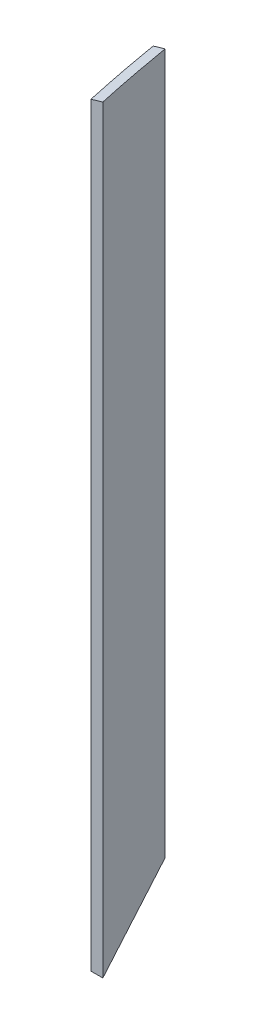
ISO-10303-21;
HEADER;
FILE_DESCRIPTION(('STEP AP214'),'2;1');
FILE_NAME('part.step','',(''),(''),'','','');
FILE_SCHEMA(('AUTOMOTIVE_DESIGN { 1 0 10303 214 1 1 1 1 }'));
ENDSEC;
DATA;
#1=APPLICATION_CONTEXT('core data for automotive mechanical design processes');
#2=APPLICATION_PROTOCOL_DEFINITION('international standard','automotive_design',2000,#1);
#3=PRODUCT_CONTEXT('',#1,'mechanical');
#4=PRODUCT('Part','Part','',(#3));
#5=PRODUCT_RELATED_PRODUCT_CATEGORY('part','',(#4));
#6=PRODUCT_DEFINITION_FORMATION('','',#4);
#7=PRODUCT_DEFINITION_CONTEXT('part definition',#1,'design');
#8=PRODUCT_DEFINITION('design','',#6,#7);
#9=PRODUCT_DEFINITION_SHAPE('','',#8);
#10=(LENGTH_UNIT() NAMED_UNIT(*) SI_UNIT(.MILLI.,.METRE.));
#11=(NAMED_UNIT(*) PLANE_ANGLE_UNIT() SI_UNIT($,.RADIAN.));
#12=(NAMED_UNIT(*) SI_UNIT($,.STERADIAN.) SOLID_ANGLE_UNIT());
#13=UNCERTAINTY_MEASURE_WITH_UNIT(LENGTH_MEASURE(1.E-05),#10,'distance_accuracy_value','');
#14=(GEOMETRIC_REPRESENTATION_CONTEXT(3) GLOBAL_UNCERTAINTY_ASSIGNED_CONTEXT((#13)) GLOBAL_UNIT_ASSIGNED_CONTEXT((#10,
#11,#12)) REPRESENTATION_CONTEXT('',''));
#15=CARTESIAN_POINT('',(0.,0.,0.));
#16=DIRECTION('',(0.,0.,1.));
#17=DIRECTION('',(1.,0.,0.));
#18=AXIS2_PLACEMENT_3D('',#15,#16,#17);
#19=CARTESIAN_POINT('',(114.914214415963,110.654023481096,18.6636491961611));
#20=CARTESIAN_POINT('',(114.611184070619,110.653984163291,18.6634138121703));
#21=CARTESIAN_POINT('',(114.006281502718,110.649256729008,18.6581194765323));
#22=CARTESIAN_POINT('',(113.093367138106,110.6278778152,18.6353544123418));
#23=CARTESIAN_POINT('',(112.194084289625,110.592697363985,18.598310150078));
#24=CARTESIAN_POINT('',(111.292961550563,110.543225730251,18.5465120004037));
#25=CARTESIAN_POINT('',(110.394159331695,110.479173108781,18.4797269812068));
#26=CARTESIAN_POINT('',(109.510730105866,110.401554350642,18.3990921743292));
#27=CARTESIAN_POINT('',(108.629162502362,110.309521585924,18.3038087322582));
#28=CARTESIAN_POINT('',(107.757994623235,110.204028625176,18.1949688212601));
#29=CARTESIAN_POINT('',(106.896892063076,110.085535649444,18.073151263622));
#30=CARTESIAN_POINT('',(106.047228797357,109.954626157281,17.9390734815831));
#31=CARTESIAN_POINT('',(105.207290973465,109.811207491047,17.7927837938395));
#32=CARTESIAN_POINT('',(104.381826238558,109.656464589371,17.6356378059314));
#33=CARTESIAN_POINT('',(103.567315661686,109.489981588804,17.467375066845));
#34=CARTESIAN_POINT('',(102.768313578101,109.31308181563,17.2894917224386));
#35=CARTESIAN_POINT('',(101.977523186544,109.124328402743,17.1007162929509));
#36=CARTESIAN_POINT('',(101.202382188891,108.925589635486,16.9030875264351));
#37=CARTESIAN_POINT('',(100.441435158046,108.716864068897,16.69674578504));
#38=CARTESIAN_POINT('',(99.6905174662784,108.496878025111,16.4806015524361));
#39=CARTESIAN_POINT('',(98.9583798181058,108.268264902668,16.2573841288218));
#40=CARTESIAN_POINT('',(98.2384911905405,108.028978937581,16.0252342983254));
#41=CARTESIAN_POINT('',(97.5394180503475,107.78195985391,15.7871163303848));
#42=CARTESIAN_POINT('',(96.8463427185053,107.521546993657,15.5377178258851));
#43=CARTESIAN_POINT('',(96.1748888599227,107.25314180938,15.2823595673198));
#44=CARTESIAN_POINT('',(95.5156605196032,106.972704046047,15.0173361468944));
#45=CARTESIAN_POINT('',(94.8724055544029,106.680786484559,14.743363131104));
#46=CARTESIAN_POINT('',(94.2466143285238,106.377513073349,14.4607214171458));
#47=CARTESIAN_POINT('',(93.6358626142223,106.062113799319,14.1688506796861));
#48=CARTESIAN_POINT('',(93.0409539180659,105.735727006808,13.8689526670047));
#49=CARTESIAN_POINT('',(92.4604597743017,105.398879283185,13.5616349357755));
#50=CARTESIAN_POINT('',(91.8934432944385,105.052325452275,13.2477022615364));
#51=CARTESIAN_POINT('',(91.3393448632937,104.697360877596,12.9284286147097));
#52=CARTESIAN_POINT('',(90.798828694388,104.336408165097,12.6060470013651));
#53=CARTESIAN_POINT('',(90.441896870051,104.089198865665,12.3868019168595));
#54=CARTESIAN_POINT('',(90.2652649998891,103.964903039145,12.2769599484237));
#55=CARTESIAN_POINT('',(114.917432828697,111.325435038433,17.5793740563256));
#56=CARTESIAN_POINT('',(114.616283067123,111.325381616022,17.5792154912705));
#57=CARTESIAN_POINT('',(114.01497634273,111.320352813837,17.5742278072858));
#58=CARTESIAN_POINT('',(113.107718985598,111.298061200236,17.552814435961));
#59=CARTESIAN_POINT('',(112.213169959315,111.261497340516,17.5179946805126));
#60=CARTESIAN_POINT('',(111.316952639713,111.210131388518,17.4692554100843));
#61=CARTESIAN_POINT('',(110.423039093705,111.143711367014,17.4064137879403));
#62=CARTESIAN_POINT('',(109.543755680366,111.063191100802,17.3305352223659));
#63=CARTESIAN_POINT('',(108.666535880975,110.967797942276,17.2409225707271));
#64=CARTESIAN_POINT('',(107.799453651856,110.858443061155,17.1386204037375));
#65=CARTESIAN_POINT('',(106.942270696443,110.73558637962,17.0242019606626));
#66=CARTESIAN_POINT('',(106.09632089071,110.599833140044,16.8983334521208));
#67=CARTESIAN_POINT('',(105.260053028799,110.451109501508,16.7610853961534));
#68=CARTESIAN_POINT('',(104.437963935601,110.29055773091,16.6137285530749));
#69=CARTESIAN_POINT('',(103.626791985348,110.117808667357,16.4560290313831));
#70=CARTESIAN_POINT('',(102.830849166859,109.934128723429,16.2893687572323));
#71=CARTESIAN_POINT('',(102.043311451687,109.738181953476,16.1125580600829));
#72=CARTESIAN_POINT('',(101.271196818408,109.53174161876,15.9274657964116));
#73=CARTESIAN_POINT('',(100.513162594962,109.314817363053,15.7341871277748));
#74=CARTESIAN_POINT('',(99.7653461450664,109.086169498983,15.5317305234433));
#75=CARTESIAN_POINT('',(99.0360206324351,108.848293920759,15.3226103583183));
#76=CARTESIAN_POINT('',(98.3190753883167,108.599268475534,15.1051183191854));
#77=CARTESIAN_POINT('',(97.6226278022079,108.341873083794,14.8820039005234));
#78=CARTESIAN_POINT('',(96.9327951974687,108.070725493788,14.648425253996));
#79=CARTESIAN_POINT('',(96.2643612992349,107.790975732426,14.409304079964));
#80=CARTESIAN_POINT('',(95.6084308796988,107.49876699236,14.1611258351854));
#81=CARTESIAN_POINT('',(94.9688554051155,107.194781919786,13.9044695794637));
#82=CARTESIAN_POINT('',(94.3465210619495,106.878883376637,13.6395555598158));
#83=CARTESIAN_POINT('',(93.739527259119,106.550843556961,13.3658187733114));
#84=CARTESIAN_POINT('',(93.1484043511051,106.211533482772,13.0843247727708));
#85=CARTESIAN_POINT('',(92.571695378069,105.861805765407,12.7957024504186));
#86=CARTESIAN_POINT('',(92.0088929730464,105.501823303219,12.5004495255258));
#87=CARTESIAN_POINT('',(91.457925123513,105.134005483409,12.200125369544));
#88=CARTESIAN_POINT('',(90.92379095385,104.758522182388,11.8966042903692));
#89=CARTESIAN_POINT('',(90.5656873706984,104.502773469585,11.6881885657459));
#90=CARTESIAN_POINT('',(90.3931566888396,104.373667783412,11.5858850803895));
#91=CARTESIAN_POINT('',(114.924288353893,112.567930828725,15.3820902940956));
#92=CARTESIAN_POINT('',(114.626952662614,112.567294272047,15.3814728773825));
#93=CARTESIAN_POINT('',(114.033087898369,112.560636953868,15.3760282542018));
#94=CARTESIAN_POINT('',(113.137746131011,112.535138488739,15.3560085805786));
#95=CARTESIAN_POINT('',(112.253537406528,112.494651292746,15.3246845377376));
#96=CARTESIAN_POINT('',(111.368145424369,112.438634923086,15.2815347570807));
#97=CARTESIAN_POINT('',(110.485132845042,112.366878720667,15.2264071592544));
#98=CARTESIAN_POINT('',(109.61533176061,112.280219057438,15.1601850803052));
#99=CARTESIAN_POINT('',(108.747969568506,112.178003361507,15.0823020141401));
#100=CARTESIAN_POINT('',(107.890169052768,112.061040963344,14.9936401230406));
#101=CARTESIAN_POINT('',(107.041847901532,111.929768012383,14.8946796133261));
#102=CARTESIAN_POINT('',(106.204225219919,111.78483693672,14.7859398762785));
#103=CARTESIAN_POINT('',(105.376045355955,111.626199009023,14.6674831804084));
#104=CARTESIAN_POINT('',(104.561299471256,111.454897129007,14.540374746647));
#105=CARTESIAN_POINT('',(103.757222239385,111.270644566807,14.4044187744586));
#106=CARTESIAN_POINT('',(102.967650116247,111.074587378596,14.2607813375011));
#107=CARTESIAN_POINT('',(102.186685659884,110.865591212205,14.1084662172202));
#108=CARTESIAN_POINT('',(101.420531987307,110.645241419426,13.949062530336));
#109=CARTESIAN_POINT('',(100.668073213269,110.413589745668,13.7826606225426));
#110=CARTESIAN_POINT('',(99.9260732697269,110.169455592139,13.6085284459086));
#111=CARTESIAN_POINT('',(99.2018966590765,109.915053592941,13.4288008486226));
#112=CARTESIAN_POINT('',(98.4902810438193,109.648699559826,13.242032887492));
#113=CARTESIAN_POINT('',(97.798482191615,109.372846058504,13.0505050034375));
#114=CARTESIAN_POINT('',(97.1144596267418,109.082683689149,12.8502353416741));
#115=CARTESIAN_POINT('',(96.451391153763,108.78281066769,12.6452515208837));
#116=CARTESIAN_POINT('',(95.8013590228653,108.469764553328,12.4324547567377));
#117=CARTESIAN_POINT('',(95.1684239078897,108.144506169287,12.2121798341504));
#118=CARTESIAN_POINT('',(94.5522140054785,107.806388209148,11.9845248767602));
#119=CARTESIAN_POINT('',(93.9518093498763,107.456281551119,11.7489417215514));
#120=CARTESIAN_POINT('',(93.367102785907,107.094608045909,11.5062838853481));
#121=CARTESIAN_POINT('',(92.7967159596334,106.722731056377,11.2571027036347));
#122=CARTESIAN_POINT('',(92.2404919226737,106.340085979492,11.001640680566));
#123=CARTESIAN_POINT('',(91.6940308697877,105.950669793942,10.7414867252566));
#124=CARTESIAN_POINT('',(91.1705864606183,105.5506881697,10.478132745835));
#125=CARTESIAN_POINT('',(90.8046501276339,105.284147764207,10.2956751941966));
#126=CARTESIAN_POINT('',(90.6420331043748,105.14503711497,10.2075713864124));
#127=CARTESIAN_POINT('',(114.93286332752,114.114718488642,12.0907167514568));
#128=CARTESIAN_POINT('',(114.640687723326,114.112844238994,12.0890485996327));
#129=CARTESIAN_POINT('',(114.057040043981,114.103291557525,12.082431180946));
#130=CARTESIAN_POINT('',(113.17837364327,114.072628950438,12.0638101938352));
#131=CARTESIAN_POINT('',(112.308898337869,114.02623472504,12.0370721826068));
#132=CARTESIAN_POINT('',(111.439130653897,113.963676404405,12.0018123209999));
#133=CARTESIAN_POINT('',(110.572006513128,113.884772769934,11.9578810194055));
#134=CARTESIAN_POINT('',(109.716144948423,113.790201982083,11.9059182726791));
#135=CARTESIAN_POINT('',(108.86326505568,113.679453073722,11.8454913591045));
#136=CARTESIAN_POINT('',(108.019089957055,113.553171521489,11.7772381165898));
#137=CARTESIAN_POINT('',(107.183727572515,113.411738153575,11.7014913192463));
#138=CARTESIAN_POINT('',(106.358194627522,113.255888739361,11.6185989634062));
#139=CARTESIAN_POINT('',(105.54164058319,113.085606634865,11.5286154492367));
#140=CARTESIAN_POINT('',(104.737322388182,112.901778019777,11.4323195303875));
#141=CARTESIAN_POINT('',(103.943188585787,112.704227142795,11.3295645242465));
#142=CARTESIAN_POINT('',(103.16239880094,112.493912839182,11.2212044004219));
#143=CARTESIAN_POINT('',(102.390405599311,112.269991229348,11.1064984895475));
#144=CARTESIAN_POINT('',(101.632255092054,112.033759241662,10.9866086102302));
#145=CARTESIAN_POINT('',(100.887173424707,111.78533555205,10.861587728903));
#146=CARTESIAN_POINT('',(100.152898364181,111.523589342433,10.7309553591927));
#147=CARTESIAN_POINT('',(99.4355104048934,111.250286988662,10.5962462090754));
#148=CARTESIAN_POINT('',(98.7310275227426,110.964086553318,10.4563830330197));
#149=CARTESIAN_POINT('',(98.0454631016887,110.666952098898,10.3130038236447));
#150=CARTESIAN_POINT('',(97.369517120234,110.35497021664,10.1633827458578));
#151=CARTESIAN_POINT('',(96.7140441957241,110.031867375892,10.0102906093209));
#152=CARTESIAN_POINT('',(96.0725604335884,109.694792744114,9.85124733693011));
#153=CARTESIAN_POINT('',(95.4494338120394,109.345128909118,9.68629181327502));
#154=CARTESIAN_POINT('',(94.8423096289559,108.981499239338,9.51535786051882));
#155=CARTESIAN_POINT('',(94.2516321341917,108.606392780779,9.33796006776094));
#156=CARTESIAN_POINT('',(93.6761834197729,108.219686058577,9.15473024578717));
#157=CARTESIAN_POINT('',(93.114843115504,107.823303023776,8.96596673455842));
#158=CARTESIAN_POINT('',(92.5672925908044,107.416206620909,8.77199121845407));
#159=CARTESIAN_POINT('',(92.026466409846,107.003819906137,8.57376973887872));
#160=CARTESIAN_POINT('',(91.5176124813038,106.577262636271,8.37264422902514));
#161=CARTESIAN_POINT('',(91.1330390417642,106.305375571814,8.23395625720348));
#162=CARTESIAN_POINT('',(90.9881261720726,106.152275143037,8.16569050873052));
#163=CARTESIAN_POINT('',(114.937174625751,115.315705283254,8.88422166455286));
#164=CARTESIAN_POINT('',(114.648944171217,115.313584239619,8.88245363851667));
#165=CARTESIAN_POINT('',(114.073034469107,115.3034725391,8.87674677885018));
#166=CARTESIAN_POINT('',(113.207165845036,115.271433004687,8.86236896257952));
#167=CARTESIAN_POINT('',(112.348616213622,115.222990073713,8.84256433934267));
#168=CARTESIAN_POINT('',(111.490616963496,115.157860641402,8.8170739975301));
#169=CARTESIAN_POINT('',(110.63553408562,115.075923838074,8.78578681757699));
#170=CARTESIAN_POINT('',(109.789918509926,114.977706813779,8.74913707393806));
#171=CARTESIAN_POINT('',(108.947879824365,114.862841162806,8.70681703054935));
#172=CARTESIAN_POINT('',(108.113839374246,114.731815141033,8.65925610237083));
#173=CARTESIAN_POINT('',(107.28810862968,114.584956276931,8.60666228611148));
#174=CARTESIAN_POINT('',(106.47153312153,114.4230639463,8.54922835909024));
#175=CARTESIAN_POINT('',(105.663674799064,114.246151328209,8.48700170732796));
#176=CARTESIAN_POINT('',(104.86710597069,114.054950922445,8.42051300984939));
#177=CARTESIAN_POINT('',(104.080482456356,113.849390193196,8.34966011767521));
#178=CARTESIAN_POINT('',(103.306326148133,113.63024479076,8.27502981555207));
#179=CARTESIAN_POINT('',(102.541419577357,113.396945458431,8.1961104614033));
#180=CARTESIAN_POINT('',(101.789702745897,113.150510845407,8.11370467123515));
#181=CARTESIAN_POINT('',(101.050745309278,112.891115691681,8.02784302100585));
#182=CARTESIAN_POINT('',(100.323263336464,112.61769497608,7.93829403478979));
#183=CARTESIAN_POINT('',(99.6120752506867,112.331581533145,7.84608733516594));
#184=CARTESIAN_POINT('',(98.9144759807662,112.031760034745,7.7504742075413));
#185=CARTESIAN_POINT('',(98.2352333508657,111.719714949332,7.65253112871263));
#186=CARTESIAN_POINT('',(97.5678213876051,111.392402300535,7.55063141890503));
#187=CARTESIAN_POINT('',(96.9207359997589,111.052695791702,7.44645244670917));
#188=CARTESIAN_POINT('',(96.2889345391717,110.698317824676,7.33807081248547));
#189=CARTESIAN_POINT('',(95.6770793672321,110.3310213849,7.22527061168337));
#190=CARTESIAN_POINT('',(95.0808015006799,109.948739202618,7.10785867718509));
#191=CARTESIAN_POINT('',(94.5019047889786,109.555469126973,6.98540856481879));
#192=CARTESIAN_POINT('',(93.9380408320726,109.150544683357,6.85834309117793));
#193=CARTESIAN_POINT('',(93.3882398338929,108.736464185495,6.72678437563267));
#194=CARTESIAN_POINT('',(92.8521855121214,108.311585582963,6.59100449215521));
#195=CARTESIAN_POINT('',(92.3197378410376,107.882892771808,6.45159691430676));
#196=CARTESIAN_POINT('',(91.8285944785214,107.436534226044,6.30962530683556));
#197=CARTESIAN_POINT('',(91.4281344983354,107.162113525745,6.2117846000377));
#198=CARTESIAN_POINT('',(91.3013684012112,106.998283649001,6.16305250764429));
#199=CARTESIAN_POINT('',(114.932163447586,116.456706466605,4.80386427139214));
#200=CARTESIAN_POINT('',(114.646792928582,116.455227024998,4.80273283147372));
#201=CARTESIAN_POINT('',(114.076379642916,116.446568591924,4.79967553848202));
#202=CARTESIAN_POINT('',(113.22027533608,116.416440380312,4.79260122883147));
#203=CARTESIAN_POINT('',(112.369184015301,116.369357429443,4.78312737107974));
#204=CARTESIAN_POINT('',(111.51984632396,116.305238089574,4.77117184766666));
#205=CARTESIAN_POINT('',(110.673964115606,116.22405272723,4.75668885008777));
#206=CARTESIAN_POINT('',(109.8355145621,116.126119280415,4.73988285825633));
#207=CARTESIAN_POINT('',(109.001704312897,116.011254383707,4.72060061542824));
#208=CARTESIAN_POINT('',(108.175346158383,115.879729907726,4.6990419832429));
#209=CARTESIAN_POINT('',(107.357052078344,115.73179062176,4.67528323486592));
#210=CARTESIAN_POINT('',(106.547479449306,115.568280158633,4.64934556249179));
#211=CARTESIAN_POINT('',(105.746755812211,115.389240272858,4.62127902298393));
#212=CARTESIAN_POINT('',(104.956595058707,115.195184831965,4.59134047533096));
#213=CARTESIAN_POINT('',(104.176589273074,114.986162058646,4.55949051009256));
#214=CARTESIAN_POINT('',(103.408445661554,114.762690020968,4.52601784198696));
#215=CARTESIAN_POINT('',(102.650695190751,114.524543402038,4.49068470864533));
#216=CARTESIAN_POINT('',(101.905843846348,114.272358629483,4.45388700044103));
#217=CARTESIAN_POINT('',(101.173906660847,114.006360554095,4.41563203273844));
#218=CARTESIAN_POINT('',(100.454904192161,113.725586602181,4.37598493730472));
#219=CARTESIAN_POINT('',(99.7519707973365,113.430782620677,4.3353978346907));
#220=CARTESIAN_POINT('',(99.0640882132463,113.121349597723,4.2935177212104));
#221=CARTESIAN_POINT('',(98.3943314484829,112.798120028442,4.25077749976452));
#222=CARTESIAN_POINT('',(97.7399081460266,112.459199891425,4.20683753377783));
#223=CARTESIAN_POINT('',(97.1060933792216,112.106308251516,4.16212482902499));
#224=CARTESIAN_POINT('',(96.4897608115322,111.737891077402,4.11538387190067));
#225=CARTESIAN_POINT('',(95.8959260400348,111.356108457206,4.06611513957652));
#226=CARTESIAN_POINT('',(95.3174825400175,110.958019268447,4.01399448351732));
#227=CARTESIAN_POINT('',(94.7580213684048,110.54946518067,3.95867125584219));
#228=CARTESIAN_POINT('',(94.2136477839051,110.129066698476,3.90031417379758));
#229=CARTESIAN_POINT('',(93.6834897857797,109.700055825692,3.83887494245544));
#230=CARTESIAN_POINT('',(93.1673459969466,109.259901846825,3.77447868314897));
#231=CARTESIAN_POINT('',(92.6506149683394,108.817694367707,3.70741512481369));
#232=CARTESIAN_POINT('',(92.188018956277,108.353218148826,3.63831100026925));
#233=CARTESIAN_POINT('',(91.7700812366647,108.079117653681,3.5902483713719));
#234=CARTESIAN_POINT('',(91.6687830961329,107.904577385449,3.56608958023977));
#235=CARTESIAN_POINT('',(114.91089821467,116.823900728959,2.05006306522136));
#236=CARTESIAN_POINT('',(114.624326233291,116.823594241705,2.04980144404081));
#237=CARTESIAN_POINT('',(114.051359316218,116.817345786532,2.04905422532069));
#238=CARTESIAN_POINT('',(113.192629094043,116.791097390367,2.04725432012016));
#239=CARTESIAN_POINT('',(112.337455373286,116.748085006081,2.04481543128824));
#240=CARTESIAN_POINT('',(111.485163882765,116.688306528184,2.04170914360372));
#241=CARTESIAN_POINT('',(110.637075797765,116.61177512989,2.0379208629042));
#242=CARTESIAN_POINT('',(109.795412585459,116.518631654667,2.03352437892435));
#243=CARTESIAN_POINT('',(108.959670666854,116.408820577333,2.02846659520302));
#244=CARTESIAN_POINT('',(108.131581425449,116.282436005261,2.02282379148673));
#245=CARTESIAN_POINT('',(107.312027861973,116.139638653058,2.0166065359517));
#246=CARTESIAN_POINT('',(106.50156856536,115.981252728008,2.00974679959702));
#247=CARTESIAN_POINT('',(105.700781607753,115.807322999511,2.00230583878759));
#248=CARTESIAN_POINT('',(104.910781694917,115.618172010654,1.99439020712139));
#249=CARTESIAN_POINT('',(104.131862821278,115.413914969673,1.98600946816327));
#250=CARTESIAN_POINT('',(103.365141331973,115.194849546568,1.9772870466317));
#251=CARTESIAN_POINT('',(102.610441252327,114.960983196968,1.96815981345401));
#252=CARTESIAN_POINT('',(101.869205968751,114.712637972987,1.95879401405366));
#253=CARTESIAN_POINT('',(101.141759168809,114.450045878421,1.94919504594197));
#254=CARTESIAN_POINT('',(100.429096703858,114.17233520483,1.93961524440706));
#255=CARTESIAN_POINT('',(99.7330547395683,113.879786055035,1.93017779238235));
#256=CARTESIAN_POINT('',(99.0538552636105,113.572090159283,1.92078115936628));
#257=CARTESIAN_POINT('',(98.3932392473444,113.249559637443,1.91148379624603));
#258=CARTESIAN_POINT('',(97.7512472440502,112.911166006078,1.90271885477966));
#259=CARTESIAN_POINT('',(97.1306239842482,112.557710013587,1.89418570950117));
#260=CARTESIAN_POINT('',(96.529662756996,112.188143946194,1.88505747882715));
#261=CARTESIAN_POINT('',(95.9535804164913,111.804822533084,1.8746870892069));
#262=CARTESIAN_POINT('',(95.3931511787511,111.404198773331,1.8626862622144));
#263=CARTESIAN_POINT('',(94.8532606398636,110.993285325136,1.84876124028406));
#264=CARTESIAN_POINT('',(94.3288005941806,110.570192163268,1.83292787725972));
#265=CARTESIAN_POINT('',(93.8189031586107,110.13860686143,1.81504430978161));
#266=CARTESIAN_POINT('',(93.3234667044732,109.695354553877,1.79513201510913));
#267=CARTESIAN_POINT('',(92.8243366077155,109.250946365833,1.77332474446836));
#268=CARTESIAN_POINT('',(92.3892916087135,108.780826833156,1.74995111045068));
#269=CARTESIAN_POINT('',(91.9622615224203,108.510771981469,1.7330387547634));
#270=CARTESIAN_POINT('',(91.8821748100789,108.331207402007,1.72446307812241));
#271=CARTESIAN_POINT('',(114.883709558158,116.94235421813,0.414110401426249));
#272=CARTESIAN_POINT('',(114.594670493989,116.942356031957,0.414110002792164));
#273=CARTESIAN_POINT('',(114.016690328031,116.936837401941,0.414204277524026));
#274=CARTESIAN_POINT('',(113.151364729845,116.912060694288,0.414635967144779));
#275=CARTESIAN_POINT('',(112.288776115593,116.870844837522,0.415362960436575));
#276=CARTESIAN_POINT('',(111.430033363978,116.813236407478,0.416390371403476));
#277=CARTESIAN_POINT('',(110.576242845901,116.739272936473,0.417723133967515));
#278=CARTESIAN_POINT('',(109.728481863833,116.648977366015,0.419366863196329));
#279=CARTESIAN_POINT('',(108.887820836699,116.542371603069,0.421324777720173));
#280=CARTESIAN_POINT('',(108.055291700096,116.419430530347,0.423609119845726));
#281=CARTESIAN_POINT('',(107.231982254953,116.280253549222,0.426198551981068));
#282=CARTESIAN_POINT('',(106.418395151331,116.125636003205,0.428982253767693));
#283=CARTESIAN_POINT('',(105.615423860411,115.955617266535,0.432029577240527));
#284=CARTESIAN_POINT('',(104.823783696197,115.770387109237,0.435368799819775));
#285=CARTESIAN_POINT('',(104.044242391654,115.57009419741,0.439038937026957));
#286=CARTESIAN_POINT('',(103.277512399156,115.354884375843,0.443076896012916));
#287=CARTESIAN_POINT('',(102.52428174659,115.124904535825,0.447517744950626));
#288=CARTESIAN_POINT('',(101.785263032252,114.88026417015,0.452406294406413));
#289=CARTESIAN_POINT('',(101.060969916092,114.621188055638,0.45775054528022));
#290=CARTESIAN_POINT('',(100.353046139485,114.346862284779,0.463903392110953));
#291=CARTESIAN_POINT('',(99.6624250156981,114.057256445411,0.470813887746122));
#292=CARTESIAN_POINT('',(98.9901425321803,113.752239977936,0.478522930952146));
#293=CARTESIAN_POINT('',(98.3370051563376,113.431778178463,0.486890881723489));
#294=CARTESIAN_POINT('',(97.704951091922,113.095394892329,0.496768522191731));
#295=CARTESIAN_POINT('',(97.0949702189059,112.743283690859,0.507473060023241));
#296=CARTESIAN_POINT('',(96.5062865404857,112.374715590632,0.518429568312062));
#297=CARTESIAN_POINT('',(95.9442050823433,111.992138058777,0.528927294128911));
#298=CARTESIAN_POINT('',(95.398052164621,111.591630129016,0.538553147784656));
#299=CARTESIAN_POINT('',(94.8735326600388,111.180890372069,0.547054066784876));
#300=CARTESIAN_POINT('',(94.3647028019798,110.757707715894,0.554365910631871));
#301=CARTESIAN_POINT('',(93.8706666045539,110.326030683682,0.560301701386338));
#302=CARTESIAN_POINT('',(93.3913749614218,109.88228306411,0.564827985468215));
#303=CARTESIAN_POINT('',(92.906266361511,109.437827144585,0.56799289009607));
#304=CARTESIAN_POINT('',(92.4918550772128,108.965447148644,0.569963574176255));
#305=CARTESIAN_POINT('',(92.0601400548522,108.698572758265,0.570370654680235));
#306=CARTESIAN_POINT('',(91.994963049351,108.516293145386,0.570498319945944));
#307=(BOUNDED_SURFACE() B_SPLINE_SURFACE(3,3,((#19,#20,#21,#22,#23,#24,#25,#26,#27,#28,#29,#30,
#31,#32,#33,#34,#35,#36,#37,#38,#39,#40,#41,#42,#43,#44,#45,#46,#47,#48,#49,#50,#51,#52,#53,
#54),(#55,#56,#57,#58,#59,#60,#61,#62,#63,#64,#65,#66,#67,#68,#69,#70,#71,#72,#73,#74,#75,#76,
#77,#78,#79,#80,#81,#82,#83,#84,#85,#86,#87,#88,#89,#90),(#91,#92,#93,#94,#95,#96,#97,#98,#99,
#100,#101,#102,#103,#104,#105,#106,#107,#108,#109,#110,#111,#112,#113,#114,#115,#116,#117,#118,
#119,#120,#121,#122,#123,#124,#125,#126),(#127,#128,#129,#130,#131,#132,#133,#134,#135,#136,
#137,#138,#139,#140,#141,#142,#143,#144,#145,#146,#147,#148,#149,#150,#151,#152,#153,#154,#155,
#156,#157,#158,#159,#160,#161,#162),(#163,#164,#165,#166,#167,#168,#169,#170,#171,#172,#173,
#174,#175,#176,#177,#178,#179,#180,#181,#182,#183,#184,#185,#186,#187,#188,#189,#190,#191,#192,
#193,#194,#195,#196,#197,#198),(#199,#200,#201,#202,#203,#204,#205,#206,#207,#208,#209,#210,
#211,#212,#213,#214,#215,#216,#217,#218,#219,#220,#221,#222,#223,#224,#225,#226,#227,#228,#229,
#230,#231,#232,#233,#234),(#235,#236,#237,#238,#239,#240,#241,#242,#243,#244,#245,#246,#247,
#248,#249,#250,#251,#252,#253,#254,#255,#256,#257,#258,#259,#260,#261,#262,#263,#264,#265,#266,
#267,#268,#269,#270),(#271,#272,#273,#274,#275,#276,#277,#278,#279,#280,#281,#282,#283,#284,
#285,#286,#287,#288,#289,#290,#291,#292,#293,#294,#295,#296,#297,#298,#299,#300,#301,#302,#303,
#304,#305,#306)),.UNSPECIFIED.,.F.,.F.,.F.) B_SPLINE_SURFACE_WITH_KNOTS((4,1,1,1,1,4),(4,1,1,1,
1,1,1,1,1,1,1,1,1,1,1,1,1,1,1,1,1,1,1,1,1,1,1,1,1,1,1,1,1,4),(0.,4.13874153545401,
8.27748307090802,12.416224606362,16.554966141816,24.8324492127241),(0.,0.891757915098714,
1.78351583019743,2.67527374529614,3.56703166039486,4.45878957549357,5.35054749059228,
6.242305405691,7.13406332078971,8.02582123588842,8.91757915098714,9.80933706608585,
10.7010949811846,11.5928528962833,12.484610811382,13.3763687264807,14.2681266415794,
15.1598845566781,16.0516424717768,16.9434003868756,17.8351583019743,18.726916217073,
19.6186741321717,20.5104320472704,21.4021899623691,22.2939478774678,23.1857057925666,
24.0774637076653,24.969221622764,25.8609795378627,26.7527374529614,27.6444953680601,
28.5362532831588,29.4280111982576),
.UNSPECIFIED.) GEOMETRIC_REPRESENTATION_ITEM() RATIONAL_B_SPLINE_SURFACE(((1.,1.,1.,1.,1.,1.,1.,
1.,1.,1.,1.,1.,1.,1.,1.,1.,1.,1.,1.,1.,1.,1.,1.,1.,1.,1.,1.,1.,1.,1.,1.,1.,1.,1.,1.,1.),(1.,1.,
1.,1.,1.,1.,1.,1.,1.,1.,1.,1.,1.,1.,1.,1.,1.,1.,1.,1.,1.,1.,1.,1.,1.,1.,1.,1.,1.,1.,1.,1.,1.,1.,
1.,1.),(1.,1.,1.,1.,1.,1.,1.,1.,1.,1.,1.,1.,1.,1.,1.,1.,1.,1.,1.,1.,1.,1.,1.,1.,1.,1.,1.,1.,1.,
1.,1.,1.,1.,1.,1.,1.),(1.,1.,1.,1.,1.,1.,1.,1.,1.,1.,1.,1.,1.,1.,1.,1.,1.,1.,1.,1.,1.,1.,1.,1.,
1.,1.,1.,1.,1.,1.,1.,1.,1.,1.,1.,1.),(1.,1.,1.,1.,1.,1.,1.,1.,1.,1.,1.,1.,1.,1.,1.,1.,1.,1.,1.,
1.,1.,1.,1.,1.,1.,1.,1.,1.,1.,1.,1.,1.,1.,1.,1.,1.),(1.,1.,1.,1.,1.,1.,1.,1.,1.,1.,1.,1.,1.,1.,
1.,1.,1.,1.,1.,1.,1.,1.,1.,1.,1.,1.,1.,1.,1.,1.,1.,1.,1.,1.,1.,1.),(1.,1.,1.,1.,1.,1.,1.,1.,1.,
1.,1.,1.,1.,1.,1.,1.,1.,1.,1.,1.,1.,1.,1.,1.,1.,1.,1.,1.,1.,1.,1.,1.,1.,1.,1.,1.),(1.,1.,1.,1.,
1.,1.,1.,1.,1.,1.,1.,1.,1.,1.,1.,1.,1.,1.,1.,1.,1.,1.,1.,1.,1.,1.,1.,1.,1.,1.,1.,1.,1.,1.,1.,1.))) REPRESENTATION_ITEM('') SURFACE());
#308=CARTESIAN_POINT('',(114.043187239656,80.0263586451021,3.5941050490699));
#309=DIRECTION('',(0.000275094440798316,-0.000942672108213505,0.999999517846056));
#310=DIRECTION('',(-0.283652229971221,0.958926716771218,0.000981985094774093));
#311=AXIS2_PLACEMENT_3D('',#308,#309,#310);
#312=CIRCLE('',#311,36.4323334808841);
#313=CARTESIAN_POINT('',(104.225071615395,115.110803081043,3.6298800767728));
#314=VERTEX_POINT('',#313);
#315=CARTESIAN_POINT('',(103.709074604748,114.96229657424,3.62988105751597));
#316=VERTEX_POINT('',#315);
#317=EDGE_CURVE('E92',#314,#316,#312,.T.);
#318=CARTESIAN_POINT('',(103.709074604748,114.96229657424,3.62988105751597));
#319=CARTESIAN_POINT('',(103.709074604748,114.885780536831,4.0054028236362));
#320=CARTESIAN_POINT('',(103.7090746039,114.802300295275,4.38685630698555));
#321=CARTESIAN_POINT('',(103.709074606213,114.711262758537,4.77397751462392));
#322=CARTESIAN_POINT('',(103.709074607669,114.653937576579,5.01774282795475));
#323=CARTESIAN_POINT('',(103.709074604748,114.593615188585,5.26375619209088));
#324=CARTESIAN_POINT('',(103.709074604748,114.530139288717,5.51195842420251));
#325=CARTESIAN_POINT('',(103.709074604748,114.461117798405,5.78184491647611));
#326=CARTESIAN_POINT('',(103.709074604748,114.388407285967,6.05416451639484));
#327=CARTESIAN_POINT('',(103.709074604748,114.311956977347,6.32878808327364));
#328=(BOUNDED_CURVE() B_SPLINE_CURVE(3,(#318,#319,#320,#321,#322,#323,#324,#325,#326,#327),
.UNSPECIFIED.,.F.,.F.) B_SPLINE_CURVE_WITH_KNOTS((4,3,3,4),(0.,1.18516457193043,
1.93144766757289,2.77694599031574),
.UNSPECIFIED.) CURVE() GEOMETRIC_REPRESENTATION_ITEM() RATIONAL_B_SPLINE_CURVE((1.,1.,1.,1.,1.,
1.,1.,1.,1.,1.)) REPRESENTATION_ITEM(''));
#329=CARTESIAN_POINT('',(103.709074604573,114.311956976921,6.3287880831552));
#330=VERTEX_POINT('',#329);
#331=EDGE_CURVE('E115',#316,#330,#328,.T.);
#332=CARTESIAN_POINT('',(103.709074604414,114.311956977438,6.3287880825772));
#333=CARTESIAN_POINT('',(103.794887165575,114.338291879015,6.3287880825772));
#334=CARTESIAN_POINT('',(103.880788746903,114.364308406041,6.32878808257722));
#335=CARTESIAN_POINT('',(104.052795736906,114.415715574015,6.32878808257722));
#336=CARTESIAN_POINT('',(104.13888423246,114.441101155486,6.3287880825772));
#337=CARTESIAN_POINT('',(104.225071631919,114.466174895057,6.3287880825772));
#338=(BOUNDED_CURVE() B_SPLINE_CURVE(3,(#332,#333,#334,#335,#336,#337),.UNSPECIFIED.,.F.,
.F.) B_SPLINE_CURVE_WITH_KNOTS((4,2,4),(1.00002888669963E-06,0.0269297774321822,
0.0538584303991791),
.UNSPECIFIED.) CURVE() GEOMETRIC_REPRESENTATION_ITEM() RATIONAL_B_SPLINE_CURVE((1.,1.,1.,1.,1.,1.)) REPRESENTATION_ITEM(''));
#339=CARTESIAN_POINT('',(104.225071631704,114.466174895798,6.32878808208483));
#340=VERTEX_POINT('',#339);
#341=EDGE_CURVE('E49',#330,#340,#338,.T.);
#342=CARTESIAN_POINT('',(104.225071631196,115.110802996581,3.62988005976674));
#343=CARTESIAN_POINT('',(104.225071631196,115.019493831563,4.08337130174194));
#344=CARTESIAN_POINT('',(104.225071631195,114.920046122763,4.53523642503487));
#345=CARTESIAN_POINT('',(104.225071631195,114.704770499934,5.4363138311633));
#346=CARTESIAN_POINT('',(104.225071631196,114.589492138581,5.88290895854404));
#347=CARTESIAN_POINT('',(104.225071631196,114.46617489504,6.32878808187528));
#348=(BOUNDED_CURVE() B_SPLINE_CURVE(3,(#342,#343,#344,#345,#346,#347),.UNSPECIFIED.,.F.,
.F.) B_SPLINE_CURVE_WITH_KNOTS((4,2,4),(-0.277203047467702,-0.138788480408411,
-3.08655516596548E-06),
.UNSPECIFIED.) CURVE() GEOMETRIC_REPRESENTATION_ITEM() RATIONAL_B_SPLINE_CURVE((1.,1.,1.,1.,1.,1.)) REPRESENTATION_ITEM(''));
#349=EDGE_CURVE('E11',#314,#340,#348,.T.);
#350=ORIENTED_EDGE('',*,*,#317,.T.);
#351=ORIENTED_EDGE('',*,*,#331,.T.);
#352=ORIENTED_EDGE('',*,*,#341,.T.);
#353=ORIENTED_EDGE('',*,*,#349,.F.);
#354=EDGE_LOOP('',(#350,#351,#352,#353));
#355=FACE_BOUND('',#354,.T.);
#356=ADVANCED_FACE('F38',(#355),#307,.T.);
#357=CARTESIAN_POINT('',(104.225071631196,84.9285707009071,5.74883018807516));
#358=DIRECTION('',(1.,0.,0.));
#359=DIRECTION('',(0.,1.,0.));
#360=AXIS2_PLACEMENT_3D('',#357,#358,#359);
#361=PLANE('',#360);
#362=ORIENTED_EDGE('',*,*,#349,.T.);
#363=DIRECTION('',(0.,-1.,0.));
#364=VECTOR('',#363,1.);
#365=CARTESIAN_POINT('',(104.225071631196,114.466203567478,6.3287880825772));
#366=LINE('',#365,#364);
#367=CARTESIAN_POINT('',(104.225071631196,81.5619643145119,6.32878808257719));
#368=VERTEX_POINT('',#367);
#369=EDGE_CURVE('E70',#340,#368,#366,.T.);
#370=ORIENTED_EDGE('',*,*,#369,.T.);
#371=DIRECTION('',(0.,0.76072482106239,-0.649074530866522));
#372=VECTOR('',#371,1.);
#373=CARTESIAN_POINT('',(104.225071631196,81.5619643145119,6.32878808257719));
#374=LINE('',#373,#372);
#375=CARTESIAN_POINT('',(104.225071631196,84.7251227286355,3.62988105751595));
#376=VERTEX_POINT('',#375);
#377=EDGE_CURVE('E97',#368,#376,#374,.T.);
#378=ORIENTED_EDGE('',*,*,#377,.T.);
#379=DIRECTION('',(0.,-1.,0.));
#380=VECTOR('',#379,1.);
#381=CARTESIAN_POINT('',(104.225071631196,115.110824522008,3.62988105751597));
#382=LINE('',#381,#380);
#383=EDGE_CURVE('E78',#314,#376,#382,.T.);
#384=ORIENTED_EDGE('',*,*,#383,.F.);
#385=EDGE_LOOP('',(#362,#370,#378,#384));
#386=FACE_BOUND('',#385,.T.);
#387=ADVANCED_FACE('F95',(#386),#361,.T.);
#388=CARTESIAN_POINT('',(103.645113736694,84.9285707009071,6.3287880825772));
#389=DIRECTION('',(0.,0.,1.));
#390=DIRECTION('',(1.,0.,0.));
#391=AXIS2_PLACEMENT_3D('',#388,#389,#390);
#392=PLANE('',#391);
#393=DIRECTION('',(0.,-1.,0.));
#394=VECTOR('',#393,1.);
#395=CARTESIAN_POINT('',(103.709074604748,114.311956975365,6.3287880825772));
#396=LINE('',#395,#394);
#397=CARTESIAN_POINT('',(103.709074604748,81.5619643145119,6.32878808257719));
#398=VERTEX_POINT('',#397);
#399=EDGE_CURVE('E83',#330,#398,#396,.T.);
#400=ORIENTED_EDGE('',*,*,#399,.T.);
#401=DIRECTION('',(1.,0.,0.));
#402=VECTOR('',#401,1.);
#403=CARTESIAN_POINT('',(103.709074604748,81.5619643145119,6.32878808257719));
#404=LINE('',#403,#402);
#405=EDGE_CURVE('E43',#398,#368,#404,.T.);
#406=ORIENTED_EDGE('',*,*,#405,.T.);
#407=ORIENTED_EDGE('',*,*,#369,.F.);
#408=ORIENTED_EDGE('',*,*,#341,.F.);
#409=EDGE_LOOP('',(#400,#406,#407,#408));
#410=FACE_BOUND('',#409,.T.);
#411=ADVANCED_FACE('F126',(#410),#392,.T.);
#412=CARTESIAN_POINT('',(103.709074604748,84.9285707009071,5.74883018807516));
#413=DIRECTION('',(-1.,0.,0.));
#414=DIRECTION('',(0.,0.,1.));
#415=AXIS2_PLACEMENT_3D('',#412,#413,#414);
#416=PLANE('',#415);
#417=DIRECTION('',(0.,-1.,0.));
#418=VECTOR('',#417,1.);
#419=CARTESIAN_POINT('',(103.709074604748,114.96229657424,3.62988105751597));
#420=LINE('',#419,#418);
#421=CARTESIAN_POINT('',(103.709074604748,84.7251227286355,3.62988105751595));
#422=VERTEX_POINT('',#421);
#423=EDGE_CURVE('E88',#316,#422,#420,.T.);
#424=ORIENTED_EDGE('',*,*,#423,.T.);
#425=DIRECTION('',(0.,-0.76072482106239,0.649074530866522));
#426=VECTOR('',#425,1.);
#427=CARTESIAN_POINT('',(103.709074604748,84.7251227286355,3.62988105751595));
#428=LINE('',#427,#426);
#429=EDGE_CURVE('E101',#422,#398,#428,.T.);
#430=ORIENTED_EDGE('',*,*,#429,.T.);
#431=ORIENTED_EDGE('',*,*,#399,.F.);
#432=ORIENTED_EDGE('',*,*,#331,.F.);
#433=EDGE_LOOP('',(#424,#430,#431,#432));
#434=FACE_BOUND('',#433,.T.);
#435=ADVANCED_FACE('F121',(#434),#416,.T.);
#436=CARTESIAN_POINT('',(103.645113736694,84.9285707009071,3.62988105751596));
#437=DIRECTION('',(0.,0.,-1.));
#438=DIRECTION('',(0.,-1.,0.));
#439=AXIS2_PLACEMENT_3D('',#436,#437,#438);
#440=PLANE('',#439);
#441=ORIENTED_EDGE('',*,*,#383,.T.);
#442=DIRECTION('',(-1.,0.,0.));
#443=VECTOR('',#442,1.);
#444=CARTESIAN_POINT('',(104.225071631196,84.7251227286355,3.62988105751595));
#445=LINE('',#444,#443);
#446=EDGE_CURVE('E98',#376,#422,#445,.T.);
#447=ORIENTED_EDGE('',*,*,#446,.T.);
#448=ORIENTED_EDGE('',*,*,#423,.F.);
#449=ORIENTED_EDGE('',*,*,#317,.F.);
#450=EDGE_LOOP('',(#441,#447,#448,#449));
#451=FACE_BOUND('',#450,.T.);
#452=ADVANCED_FACE('F93',(#451),#440,.T.);
#453=CARTESIAN_POINT('',(104.225071631196,83.1435435215737,4.97933457004657));
#454=DIRECTION('',(0.,-0.649074530866522,-0.76072482106239));
#455=DIRECTION('',(0.,-0.76072482106239,0.649074530866522));
#456=AXIS2_PLACEMENT_3D('',#453,#454,#455);
#457=PLANE('',#456);
#458=ORIENTED_EDGE('',*,*,#377,.F.);
#459=ORIENTED_EDGE('',*,*,#405,.F.);
#460=ORIENTED_EDGE('',*,*,#429,.F.);
#461=ORIENTED_EDGE('',*,*,#446,.F.);
#462=EDGE_LOOP('',(#458,#459,#460,#461));
#463=FACE_BOUND('',#462,.T.);
#464=ADVANCED_FACE('F125',(#463),#457,.T.);
#465=CLOSED_SHELL('',(#356,#387,#411,#435,#452,#464));
#466=MANIFOLD_SOLID_BREP('B2',#465);
#467=ADVANCED_BREP_SHAPE_REPRESENTATION('',(#18,#466),#14);
#468=SHAPE_DEFINITION_REPRESENTATION(#9,#467);
ENDSEC;
END-ISO-10303-21;
